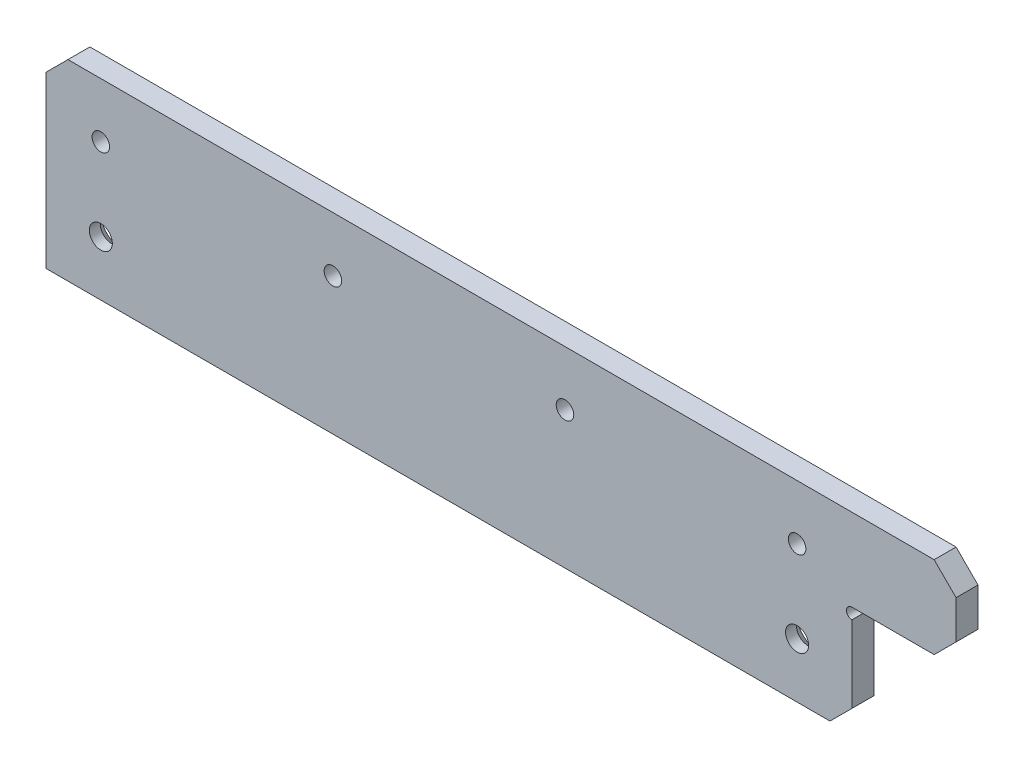
ISO-10303-21;
HEADER;
FILE_DESCRIPTION(('STEP AP214'),'2;1');
FILE_NAME('part.step','',(''),(''),'','','');
FILE_SCHEMA(('AUTOMOTIVE_DESIGN { 1 0 10303 214 1 1 1 1 }'));
ENDSEC;
DATA;
#1=APPLICATION_CONTEXT('core data for automotive mechanical design processes');
#2=APPLICATION_PROTOCOL_DEFINITION('international standard','automotive_design',2000,#1);
#3=PRODUCT_CONTEXT('',#1,'mechanical');
#4=PRODUCT('Part','Part','',(#3));
#5=PRODUCT_RELATED_PRODUCT_CATEGORY('part','',(#4));
#6=PRODUCT_DEFINITION_FORMATION('','',#4);
#7=PRODUCT_DEFINITION_CONTEXT('part definition',#1,'design');
#8=PRODUCT_DEFINITION('design','',#6,#7);
#9=PRODUCT_DEFINITION_SHAPE('','',#8);
#10=(LENGTH_UNIT() NAMED_UNIT(*) SI_UNIT(.MILLI.,.METRE.));
#11=(NAMED_UNIT(*) PLANE_ANGLE_UNIT() SI_UNIT($,.RADIAN.));
#12=(NAMED_UNIT(*) SI_UNIT($,.STERADIAN.) SOLID_ANGLE_UNIT());
#13=UNCERTAINTY_MEASURE_WITH_UNIT(LENGTH_MEASURE(1.E-05),#10,'distance_accuracy_value','');
#14=(GEOMETRIC_REPRESENTATION_CONTEXT(3) GLOBAL_UNCERTAINTY_ASSIGNED_CONTEXT((#13)) GLOBAL_UNIT_ASSIGNED_CONTEXT((#10,
#11,#12)) REPRESENTATION_CONTEXT('',''));
#15=CARTESIAN_POINT('',(0.,0.,0.));
#16=DIRECTION('',(0.,0.,1.));
#17=DIRECTION('',(1.,0.,0.));
#18=AXIS2_PLACEMENT_3D('',#15,#16,#17);
#19=CARTESIAN_POINT('',(-73.5,-17.5,2.));
#20=DIRECTION('',(1.,0.,0.));
#21=DIRECTION('',(0.,0.,-1.));
#22=AXIS2_PLACEMENT_3D('',#19,#20,#21);
#23=PLANE('',#22);
#24=DIRECTION('',(0.,-1.,0.));
#25=VECTOR('',#24,1.);
#26=CARTESIAN_POINT('',(-73.5,-17.5,2.));
#27=LINE('',#26,#25);
#28=CARTESIAN_POINT('',(-73.5,13.5,2.));
#29=VERTEX_POINT('',#28);
#30=CARTESIAN_POINT('',(-73.5,-17.5,2.));
#31=VERTEX_POINT('',#30);
#32=EDGE_CURVE('E161',#29,#31,#27,.T.);
#33=ORIENTED_EDGE('',*,*,#32,.F.);
#34=DIRECTION('',(0.,0.,-1.));
#35=VECTOR('',#34,1.);
#36=CARTESIAN_POINT('',(-73.5,13.5,2.));
#37=LINE('',#36,#35);
#38=CARTESIAN_POINT('',(-73.5,13.5,-2.));
#39=VERTEX_POINT('',#38);
#40=EDGE_CURVE('E211',#29,#39,#37,.T.);
#41=ORIENTED_EDGE('',*,*,#40,.T.);
#42=DIRECTION('',(0.,-1.,0.));
#43=VECTOR('',#42,1.);
#44=CARTESIAN_POINT('',(-73.5,-17.5,-2.));
#45=LINE('',#44,#43);
#46=CARTESIAN_POINT('',(-73.5,-17.5,-2.));
#47=VERTEX_POINT('',#46);
#48=EDGE_CURVE('E132',#39,#47,#45,.T.);
#49=ORIENTED_EDGE('',*,*,#48,.T.);
#50=DIRECTION('',(0.,0.,-1.));
#51=VECTOR('',#50,1.);
#52=CARTESIAN_POINT('',(-73.5,-17.5,2.));
#53=LINE('',#52,#51);
#54=EDGE_CURVE('E171',#31,#47,#53,.T.);
#55=ORIENTED_EDGE('',*,*,#54,.F.);
#56=EDGE_LOOP('',(#33,#41,#49,#55));
#57=FACE_BOUND('',#56,.T.);
#58=ADVANCED_FACE('F37',(#57),#23,.F.);
#59=CARTESIAN_POINT('',(73.5,-17.5,2.));
#60=DIRECTION('',(0.,1.,0.));
#61=DIRECTION('',(-1.,0.,0.));
#62=AXIS2_PLACEMENT_3D('',#59,#60,#61);
#63=PLANE('',#62);
#64=DIRECTION('',(1.,0.,0.));
#65=VECTOR('',#64,1.);
#66=CARTESIAN_POINT('',(73.5,-17.5,-2.));
#67=LINE('',#66,#65);
#68=CARTESIAN_POINT('',(69.5,-17.5,-2.));
#69=VERTEX_POINT('',#68);
#70=EDGE_CURVE('E173',#47,#69,#67,.T.);
#71=ORIENTED_EDGE('',*,*,#70,.T.);
#72=DIRECTION('',(0.,0.,1.));
#73=VECTOR('',#72,1.);
#74=CARTESIAN_POINT('',(69.5,-17.5,2.));
#75=LINE('',#74,#73);
#76=CARTESIAN_POINT('',(69.5,-17.5,2.));
#77=VERTEX_POINT('',#76);
#78=EDGE_CURVE('E209',#69,#77,#75,.T.);
#79=ORIENTED_EDGE('',*,*,#78,.T.);
#80=DIRECTION('',(1.,0.,0.));
#81=VECTOR('',#80,1.);
#82=CARTESIAN_POINT('',(73.5,-17.5,2.));
#83=LINE('',#82,#81);
#84=EDGE_CURVE('E163',#31,#77,#83,.T.);
#85=ORIENTED_EDGE('',*,*,#84,.F.);
#86=ORIENTED_EDGE('',*,*,#54,.T.);
#87=EDGE_LOOP('',(#71,#79,#85,#86));
#88=FACE_BOUND('',#87,.T.);
#89=ADVANCED_FACE('F304',(#88),#63,.F.);
#90=CARTESIAN_POINT('',(73.5,-17.5,2.));
#91=DIRECTION('',(-1.,0.,0.));
#92=DIRECTION('',(0.,0.,1.));
#93=AXIS2_PLACEMENT_3D('',#90,#91,#92);
#94=PLANE('',#93);
#95=DIRECTION('',(0.,1.,0.));
#96=VECTOR('',#95,1.);
#97=CARTESIAN_POINT('',(73.5,-17.5,-2.));
#98=LINE('',#97,#96);
#99=CARTESIAN_POINT('',(73.5,-13.5,-2.));
#100=VERTEX_POINT('',#99);
#101=CARTESIAN_POINT('',(73.5,0.500000000000011,-2.));
#102=VERTEX_POINT('',#101);
#103=EDGE_CURVE('E175',#100,#102,#98,.T.);
#104=ORIENTED_EDGE('',*,*,#103,.T.);
#105=DIRECTION('',(0.,0.,1.));
#106=VECTOR('',#105,1.);
#107=CARTESIAN_POINT('',(73.5,0.500000000000011,-2.));
#108=LINE('',#107,#106);
#109=CARTESIAN_POINT('',(73.5,0.500000000000011,2.));
#110=VERTEX_POINT('',#109);
#111=EDGE_CURVE('E257',#102,#110,#108,.T.);
#112=ORIENTED_EDGE('',*,*,#111,.T.);
#113=DIRECTION('',(0.,1.,0.));
#114=VECTOR('',#113,1.);
#115=CARTESIAN_POINT('',(73.5,-17.5,2.));
#116=LINE('',#115,#114);
#117=CARTESIAN_POINT('',(73.5,-13.5,2.));
#118=VERTEX_POINT('',#117);
#119=EDGE_CURVE('E142',#118,#110,#116,.T.);
#120=ORIENTED_EDGE('',*,*,#119,.F.);
#121=DIRECTION('',(0.,0.,-1.));
#122=VECTOR('',#121,1.);
#123=CARTESIAN_POINT('',(73.5,-13.5,2.));
#124=LINE('',#123,#122);
#125=EDGE_CURVE('E207',#118,#100,#124,.T.);
#126=ORIENTED_EDGE('',*,*,#125,.T.);
#127=EDGE_LOOP('',(#104,#112,#120,#126));
#128=FACE_BOUND('',#127,.T.);
#129=ADVANCED_FACE('F310',(#128),#94,.F.);
#130=CARTESIAN_POINT('',(73.5,17.5,2.));
#131=DIRECTION('',(0.,-1.,0.));
#132=DIRECTION('',(1.,0.,0.));
#133=AXIS2_PLACEMENT_3D('',#130,#131,#132);
#134=PLANE('',#133);
#135=DIRECTION('',(-1.,0.,0.));
#136=VECTOR('',#135,1.);
#137=CARTESIAN_POINT('',(73.5,17.5,2.));
#138=LINE('',#137,#136);
#139=CARTESIAN_POINT('',(88.5,17.5,2.));
#140=VERTEX_POINT('',#139);
#141=CARTESIAN_POINT('',(-69.5,17.5,2.));
#142=VERTEX_POINT('',#141);
#143=EDGE_CURVE('E168',#140,#142,#138,.T.);
#144=ORIENTED_EDGE('',*,*,#143,.F.);
#145=DIRECTION('',(0.,0.,-1.));
#146=VECTOR('',#145,1.);
#147=CARTESIAN_POINT('',(88.5,17.5,-2.));
#148=LINE('',#147,#146);
#149=CARTESIAN_POINT('',(88.5,17.5,-2.));
#150=VERTEX_POINT('',#149);
#151=EDGE_CURVE('E197',#140,#150,#148,.T.);
#152=ORIENTED_EDGE('',*,*,#151,.T.);
#153=DIRECTION('',(-1.,0.,0.));
#154=VECTOR('',#153,1.);
#155=CARTESIAN_POINT('',(73.5,17.5,-2.));
#156=LINE('',#155,#154);
#157=CARTESIAN_POINT('',(-69.5,17.5,-2.));
#158=VERTEX_POINT('',#157);
#159=EDGE_CURVE('E164',#150,#158,#156,.T.);
#160=ORIENTED_EDGE('',*,*,#159,.T.);
#161=DIRECTION('',(0.,0.,1.));
#162=VECTOR('',#161,1.);
#163=CARTESIAN_POINT('',(-69.5,17.5,2.));
#164=LINE('',#163,#162);
#165=EDGE_CURVE('E195',#158,#142,#164,.T.);
#166=ORIENTED_EDGE('',*,*,#165,.T.);
#167=EDGE_LOOP('',(#144,#152,#160,#166));
#168=FACE_BOUND('',#167,.T.);
#169=ADVANCED_FACE('F281',(#168),#134,.F.);
#170=CARTESIAN_POINT('',(0.,0.,2.));
#171=DIRECTION('',(0.,0.,1.));
#172=DIRECTION('',(1.,0.,0.));
#173=AXIS2_PLACEMENT_3D('',#170,#171,#172);
#174=PLANE('',#173);
#175=CARTESIAN_POINT('',(-63.5,7.49999999999999,2.));
#176=DIRECTION('',(0.,0.,1.));
#177=DIRECTION('',(1.,0.,0.));
#178=AXIS2_PLACEMENT_3D('',#175,#176,#177);
#179=CIRCLE('',#178,1.6);
#180=CARTESIAN_POINT('',(-61.9,7.49999999999999,2.));
#181=VERTEX_POINT('',#180);
#182=EDGE_CURVE('E273',#181,#181,#179,.T.);
#183=ORIENTED_EDGE('',*,*,#182,.F.);
#184=EDGE_LOOP('',(#183));
#185=FACE_BOUND('',#184,.T.);
#186=CARTESIAN_POINT('',(-21.1666666666667,7.49999999999999,2.));
#187=DIRECTION('',(0.,0.,1.));
#188=DIRECTION('',(1.,0.,0.));
#189=AXIS2_PLACEMENT_3D('',#186,#187,#188);
#190=CIRCLE('',#189,1.6);
#191=CARTESIAN_POINT('',(-19.5666666666667,7.49999999999999,2.));
#192=VERTEX_POINT('',#191);
#193=EDGE_CURVE('E269',#192,#192,#190,.T.);
#194=ORIENTED_EDGE('',*,*,#193,.F.);
#195=EDGE_LOOP('',(#194));
#196=FACE_BOUND('',#195,.T.);
#197=CARTESIAN_POINT('',(21.1666666666667,7.49999999999999,2.));
#198=DIRECTION('',(0.,0.,1.));
#199=DIRECTION('',(1.,0.,0.));
#200=AXIS2_PLACEMENT_3D('',#197,#198,#199);
#201=CIRCLE('',#200,1.6);
#202=CARTESIAN_POINT('',(22.7666666666667,7.49999999999999,2.));
#203=VERTEX_POINT('',#202);
#204=EDGE_CURVE('E265',#203,#203,#201,.T.);
#205=ORIENTED_EDGE('',*,*,#204,.F.);
#206=EDGE_LOOP('',(#205));
#207=FACE_BOUND('',#206,.T.);
#208=CARTESIAN_POINT('',(63.5,7.49999999999999,2.));
#209=DIRECTION('',(0.,0.,1.));
#210=DIRECTION('',(1.,0.,0.));
#211=AXIS2_PLACEMENT_3D('',#208,#209,#210);
#212=CIRCLE('',#211,1.6);
#213=CARTESIAN_POINT('',(65.1,7.49999999999999,2.));
#214=VERTEX_POINT('',#213);
#215=EDGE_CURVE('E261',#214,#214,#212,.T.);
#216=ORIENTED_EDGE('',*,*,#215,.F.);
#217=EDGE_LOOP('',(#216));
#218=FACE_BOUND('',#217,.T.);
#219=CARTESIAN_POINT('',(73.5,1.50000000000001,2.));
#220=DIRECTION('',(0.,0.,1.));
#221=DIRECTION('',(1.,0.,0.));
#222=AXIS2_PLACEMENT_3D('',#219,#220,#221);
#223=CIRCLE('',#222,0.999999999999998);
#224=CARTESIAN_POINT('',(73.5,2.50000000000001,2.));
#225=VERTEX_POINT('',#224);
#226=EDGE_CURVE('E124',#225,#110,#223,.T.);
#227=ORIENTED_EDGE('',*,*,#226,.F.);
#228=DIRECTION('',(1.,0.,0.));
#229=VECTOR('',#228,1.);
#230=CARTESIAN_POINT('',(73.5,2.50000000000001,2.));
#231=LINE('',#230,#229);
#232=CARTESIAN_POINT('',(88.5,2.50000000000001,2.));
#233=VERTEX_POINT('',#232);
#234=EDGE_CURVE('E140',#225,#233,#231,.T.);
#235=ORIENTED_EDGE('',*,*,#234,.T.);
#236=DIRECTION('',(-0.707106781186546,-0.707106781186549,0.));
#237=VECTOR('',#236,1.);
#238=CARTESIAN_POINT('',(43.0000000000001,-43.,2.));
#239=LINE('',#238,#237);
#240=CARTESIAN_POINT('',(92.5,6.50000000000004,2.));
#241=VERTEX_POINT('',#240);
#242=EDGE_CURVE('E191',#233,#241,#239,.F.);
#243=ORIENTED_EDGE('',*,*,#242,.T.);
#244=DIRECTION('',(0.,1.,0.));
#245=VECTOR('',#244,1.);
#246=CARTESIAN_POINT('',(92.5,17.5,2.));
#247=LINE('',#246,#245);
#248=CARTESIAN_POINT('',(92.5,13.5,2.));
#249=VERTEX_POINT('',#248);
#250=EDGE_CURVE('E149',#241,#249,#247,.T.);
#251=ORIENTED_EDGE('',*,*,#250,.T.);
#252=DIRECTION('',(-0.707106781186549,0.707106781186546,0.));
#253=VECTOR('',#252,1.);
#254=CARTESIAN_POINT('',(52.9999999999999,53.,2.));
#255=LINE('',#254,#253);
#256=EDGE_CURVE('E193',#249,#140,#255,.T.);
#257=ORIENTED_EDGE('',*,*,#256,.T.);
#258=ORIENTED_EDGE('',*,*,#143,.T.);
#259=DIRECTION('',(0.70710678118655,0.707106781186545,0.));
#260=VECTOR('',#259,1.);
#261=CARTESIAN_POINT('',(-43.4999999999997,43.5,2.));
#262=LINE('',#261,#260);
#263=EDGE_CURVE('E187',#142,#29,#262,.F.);
#264=ORIENTED_EDGE('',*,*,#263,.T.);
#265=ORIENTED_EDGE('',*,*,#32,.T.);
#266=ORIENTED_EDGE('',*,*,#84,.T.);
#267=DIRECTION('',(-0.707106781186549,-0.707106781186546,0.));
#268=VECTOR('',#267,1.);
#269=CARTESIAN_POINT('',(43.4999999999999,-43.5,2.));
#270=LINE('',#269,#268);
#271=EDGE_CURVE('E189',#77,#118,#270,.F.);
#272=ORIENTED_EDGE('',*,*,#271,.T.);
#273=ORIENTED_EDGE('',*,*,#119,.T.);
#274=EDGE_LOOP('',(#227,#235,#243,#251,#257,#258,#264,#265,#266,#272,#273));
#275=FACE_BOUND('',#274,.T.);
#276=CARTESIAN_POINT('',(-63.5,-7.50000000000001,2.));
#277=DIRECTION('',(0.,0.,1.));
#278=DIRECTION('',(1.,0.,0.));
#279=AXIS2_PLACEMENT_3D('',#276,#277,#278);
#280=CIRCLE('',#279,2.1);
#281=CARTESIAN_POINT('',(-61.4,-7.50000000000001,2.));
#282=VERTEX_POINT('',#281);
#283=EDGE_CURVE('E150',#282,#282,#280,.T.);
#284=ORIENTED_EDGE('',*,*,#283,.F.);
#285=EDGE_LOOP('',(#284));
#286=FACE_BOUND('',#285,.T.);
#287=CARTESIAN_POINT('',(63.5,-7.50000000000001,2.));
#288=DIRECTION('',(0.,0.,1.));
#289=DIRECTION('',(1.,0.,0.));
#290=AXIS2_PLACEMENT_3D('',#287,#288,#289);
#291=CIRCLE('',#290,2.09999999999999);
#292=CARTESIAN_POINT('',(65.6,-7.50000000000001,2.));
#293=VERTEX_POINT('',#292);
#294=EDGE_CURVE('E156',#293,#293,#291,.T.);
#295=ORIENTED_EDGE('',*,*,#294,.F.);
#296=EDGE_LOOP('',(#295));
#297=FACE_BOUND('',#296,.T.);
#298=ADVANCED_FACE('F138',(#185,#196,#207,#218,#275,#286,#297),#174,.T.);
#299=CARTESIAN_POINT('',(0.,0.,-2.));
#300=DIRECTION('',(0.,0.,1.));
#301=DIRECTION('',(1.,0.,0.));
#302=AXIS2_PLACEMENT_3D('',#299,#300,#301);
#303=PLANE('',#302);
#304=CARTESIAN_POINT('',(63.5,-7.50000000000001,-2.));
#305=DIRECTION('',(0.,0.,1.));
#306=DIRECTION('',(1.,0.,0.));
#307=AXIS2_PLACEMENT_3D('',#304,#305,#306);
#308=CIRCLE('',#307,4.10000000000001);
#309=CARTESIAN_POINT('',(67.6,-7.50000000000001,-2.));
#310=VERTEX_POINT('',#309);
#311=EDGE_CURVE('E217',#310,#310,#308,.T.);
#312=ORIENTED_EDGE('',*,*,#311,.T.);
#313=EDGE_LOOP('',(#312));
#314=FACE_BOUND('',#313,.T.);
#315=CARTESIAN_POINT('',(-63.5,-7.50000000000001,-2.));
#316=DIRECTION('',(0.,0.,1.));
#317=DIRECTION('',(1.,0.,0.));
#318=AXIS2_PLACEMENT_3D('',#315,#316,#317);
#319=CIRCLE('',#318,4.09999999999999);
#320=CARTESIAN_POINT('',(-59.4,-7.50000000000001,-2.));
#321=VERTEX_POINT('',#320);
#322=EDGE_CURVE('E214',#321,#321,#319,.T.);
#323=ORIENTED_EDGE('',*,*,#322,.T.);
#324=EDGE_LOOP('',(#323));
#325=FACE_BOUND('',#324,.T.);
#326=CARTESIAN_POINT('',(-63.5,7.49999999999999,-2.));
#327=DIRECTION('',(0.,0.,1.));
#328=DIRECTION('',(1.,0.,0.));
#329=AXIS2_PLACEMENT_3D('',#326,#327,#328);
#330=CIRCLE('',#329,1.6);
#331=CARTESIAN_POINT('',(-61.9,7.49999999999999,-2.));
#332=VERTEX_POINT('',#331);
#333=EDGE_CURVE('E143',#332,#332,#330,.T.);
#334=ORIENTED_EDGE('',*,*,#333,.T.);
#335=EDGE_LOOP('',(#334));
#336=FACE_BOUND('',#335,.T.);
#337=CARTESIAN_POINT('',(-21.1666666666667,7.49999999999999,-2.));
#338=DIRECTION('',(0.,0.,1.));
#339=DIRECTION('',(1.,0.,0.));
#340=AXIS2_PLACEMENT_3D('',#337,#338,#339);
#341=CIRCLE('',#340,1.6);
#342=CARTESIAN_POINT('',(-19.5666666666667,7.49999999999999,-2.));
#343=VERTEX_POINT('',#342);
#344=EDGE_CURVE('E244',#343,#343,#341,.T.);
#345=ORIENTED_EDGE('',*,*,#344,.T.);
#346=EDGE_LOOP('',(#345));
#347=FACE_BOUND('',#346,.T.);
#348=CARTESIAN_POINT('',(21.1666666666667,7.49999999999999,-2.));
#349=DIRECTION('',(0.,0.,1.));
#350=DIRECTION('',(1.,0.,0.));
#351=AXIS2_PLACEMENT_3D('',#348,#349,#350);
#352=CIRCLE('',#351,1.6);
#353=CARTESIAN_POINT('',(22.7666666666667,7.49999999999999,-2.));
#354=VERTEX_POINT('',#353);
#355=EDGE_CURVE('E248',#354,#354,#352,.T.);
#356=ORIENTED_EDGE('',*,*,#355,.T.);
#357=EDGE_LOOP('',(#356));
#358=FACE_BOUND('',#357,.T.);
#359=CARTESIAN_POINT('',(63.5,7.49999999999999,-2.));
#360=DIRECTION('',(0.,0.,1.));
#361=DIRECTION('',(1.,0.,0.));
#362=AXIS2_PLACEMENT_3D('',#359,#360,#361);
#363=CIRCLE('',#362,1.6);
#364=CARTESIAN_POINT('',(65.1,7.49999999999999,-2.));
#365=VERTEX_POINT('',#364);
#366=EDGE_CURVE('E251',#365,#365,#363,.T.);
#367=ORIENTED_EDGE('',*,*,#366,.T.);
#368=EDGE_LOOP('',(#367));
#369=FACE_BOUND('',#368,.T.);
#370=DIRECTION('',(1.,0.,0.));
#371=VECTOR('',#370,1.);
#372=CARTESIAN_POINT('',(73.5,2.50000000000001,-2.));
#373=LINE('',#372,#371);
#374=CARTESIAN_POINT('',(73.5,2.50000000000001,-2.));
#375=VERTEX_POINT('',#374);
#376=CARTESIAN_POINT('',(88.5,2.50000000000001,-2.));
#377=VERTEX_POINT('',#376);
#378=EDGE_CURVE('E153',#375,#377,#373,.T.);
#379=ORIENTED_EDGE('',*,*,#378,.F.);
#380=CARTESIAN_POINT('',(73.5,1.50000000000001,-2.));
#381=DIRECTION('',(0.,0.,1.));
#382=DIRECTION('',(1.,0.,0.));
#383=AXIS2_PLACEMENT_3D('',#380,#381,#382);
#384=CIRCLE('',#383,0.999999999999998);
#385=EDGE_CURVE('E127',#375,#102,#384,.T.);
#386=ORIENTED_EDGE('',*,*,#385,.T.);
#387=ORIENTED_EDGE('',*,*,#103,.F.);
#388=DIRECTION('',(0.707106781186549,0.707106781186546,0.));
#389=VECTOR('',#388,1.);
#390=CARTESIAN_POINT('',(73.5,-13.5,-2.));
#391=LINE('',#390,#389);
#392=EDGE_CURVE('E53',#100,#69,#391,.F.);
#393=ORIENTED_EDGE('',*,*,#392,.T.);
#394=ORIENTED_EDGE('',*,*,#70,.F.);
#395=ORIENTED_EDGE('',*,*,#48,.F.);
#396=DIRECTION('',(-0.70710678118655,-0.707106781186545,0.));
#397=VECTOR('',#396,1.);
#398=CARTESIAN_POINT('',(-73.5,13.5,-2.));
#399=LINE('',#398,#397);
#400=EDGE_CURVE('E199',#39,#158,#399,.F.);
#401=ORIENTED_EDGE('',*,*,#400,.T.);
#402=ORIENTED_EDGE('',*,*,#159,.F.);
#403=DIRECTION('',(0.707106781186549,-0.707106781186546,0.));
#404=VECTOR('',#403,1.);
#405=CARTESIAN_POINT('',(92.5,13.5,-2.));
#406=LINE('',#405,#404);
#407=CARTESIAN_POINT('',(92.5,13.5,-2.));
#408=VERTEX_POINT('',#407);
#409=EDGE_CURVE('E204',#150,#408,#406,.T.);
#410=ORIENTED_EDGE('',*,*,#409,.T.);
#411=DIRECTION('',(0.,1.,0.));
#412=VECTOR('',#411,1.);
#413=CARTESIAN_POINT('',(92.5,17.5,-2.));
#414=LINE('',#413,#412);
#415=CARTESIAN_POINT('',(92.5,6.50000000000004,-2.));
#416=VERTEX_POINT('',#415);
#417=EDGE_CURVE('E133',#416,#408,#414,.T.);
#418=ORIENTED_EDGE('',*,*,#417,.F.);
#419=DIRECTION('',(0.707106781186546,0.707106781186549,0.));
#420=VECTOR('',#419,1.);
#421=CARTESIAN_POINT('',(88.5,2.50000000000001,-2.));
#422=LINE('',#421,#420);
#423=EDGE_CURVE('E202',#416,#377,#422,.F.);
#424=ORIENTED_EDGE('',*,*,#423,.T.);
#425=EDGE_LOOP('',(#379,#386,#387,#393,#394,#395,#401,#402,#410,#418,#424));
#426=FACE_BOUND('',#425,.T.);
#427=ADVANCED_FACE('F231',(#314,#325,#336,#347,#358,#369,#426),#303,.F.);
#428=CARTESIAN_POINT('',(92.5,17.5,-2.));
#429=DIRECTION('',(1.,0.,0.));
#430=DIRECTION('',(0.,0.,-1.));
#431=AXIS2_PLACEMENT_3D('',#428,#429,#430);
#432=PLANE('',#431);
#433=ORIENTED_EDGE('',*,*,#417,.T.);
#434=DIRECTION('',(0.,0.,1.));
#435=VECTOR('',#434,1.);
#436=CARTESIAN_POINT('',(92.5,13.5,2.));
#437=LINE('',#436,#435);
#438=EDGE_CURVE('E184',#408,#249,#437,.T.);
#439=ORIENTED_EDGE('',*,*,#438,.T.);
#440=ORIENTED_EDGE('',*,*,#250,.F.);
#441=DIRECTION('',(0.,0.,-1.));
#442=VECTOR('',#441,1.);
#443=CARTESIAN_POINT('',(92.5,6.50000000000004,-2.));
#444=LINE('',#443,#442);
#445=EDGE_CURVE('E182',#241,#416,#444,.T.);
#446=ORIENTED_EDGE('',*,*,#445,.T.);
#447=EDGE_LOOP('',(#433,#439,#440,#446));
#448=FACE_BOUND('',#447,.T.);
#449=ADVANCED_FACE('F234',(#448),#432,.T.);
#450=CARTESIAN_POINT('',(73.5,2.50000000000001,-2.));
#451=DIRECTION('',(0.,-1.,0.));
#452=DIRECTION('',(0.,0.,-1.));
#453=AXIS2_PLACEMENT_3D('',#450,#451,#452);
#454=PLANE('',#453);
#455=ORIENTED_EDGE('',*,*,#378,.T.);
#456=DIRECTION('',(0.,0.,1.));
#457=VECTOR('',#456,1.);
#458=CARTESIAN_POINT('',(88.5,2.50000000000001,-2.));
#459=LINE('',#458,#457);
#460=EDGE_CURVE('E148',#377,#233,#459,.T.);
#461=ORIENTED_EDGE('',*,*,#460,.T.);
#462=ORIENTED_EDGE('',*,*,#234,.F.);
#463=DIRECTION('',(0.,0.,1.));
#464=VECTOR('',#463,1.);
#465=CARTESIAN_POINT('',(73.5,2.50000000000001,-2.));
#466=LINE('',#465,#464);
#467=EDGE_CURVE('E121',#375,#225,#466,.T.);
#468=ORIENTED_EDGE('',*,*,#467,.F.);
#469=EDGE_LOOP('',(#455,#461,#462,#468));
#470=FACE_BOUND('',#469,.T.);
#471=ADVANCED_FACE('F146',(#470),#454,.T.);
#472=CARTESIAN_POINT('',(63.5,-7.50000000000001,-2.));
#473=DIRECTION('',(0.,0.,1.));
#474=DIRECTION('',(1.,0.,0.));
#475=AXIS2_PLACEMENT_3D('',#472,#473,#474);
#476=CYLINDRICAL_SURFACE('',#475,2.09999999999999);
#477=CARTESIAN_POINT('',(63.5,-7.50000000000001,0.));
#478=DIRECTION('',(0.,0.,1.));
#479=DIRECTION('',(1.,0.,0.));
#480=AXIS2_PLACEMENT_3D('',#477,#478,#479);
#481=CIRCLE('',#480,2.09999999999999);
#482=CARTESIAN_POINT('',(65.6,-7.50000000000001,0.));
#483=VERTEX_POINT('',#482);
#484=EDGE_CURVE('E46',#483,#483,#481,.F.);
#485=ORIENTED_EDGE('',*,*,#484,.T.);
#486=EDGE_LOOP('',(#485));
#487=FACE_BOUND('',#486,.T.);
#488=ORIENTED_EDGE('',*,*,#294,.T.);
#489=EDGE_LOOP('',(#488));
#490=FACE_BOUND('',#489,.T.);
#491=ADVANCED_FACE('F222',(#487,#490),#476,.F.);
#492=CARTESIAN_POINT('',(-63.5,-7.50000000000001,-2.));
#493=DIRECTION('',(0.,0.,1.));
#494=DIRECTION('',(1.,0.,0.));
#495=AXIS2_PLACEMENT_3D('',#492,#493,#494);
#496=CYLINDRICAL_SURFACE('',#495,2.1);
#497=CARTESIAN_POINT('',(-63.5,-7.50000000000001,0.));
#498=DIRECTION('',(0.,0.,1.));
#499=DIRECTION('',(1.,0.,0.));
#500=AXIS2_PLACEMENT_3D('',#497,#498,#499);
#501=CIRCLE('',#500,2.1);
#502=CARTESIAN_POINT('',(-61.4,-7.50000000000001,0.));
#503=VERTEX_POINT('',#502);
#504=EDGE_CURVE('E11',#503,#503,#501,.F.);
#505=ORIENTED_EDGE('',*,*,#504,.T.);
#506=EDGE_LOOP('',(#505));
#507=FACE_BOUND('',#506,.T.);
#508=ORIENTED_EDGE('',*,*,#283,.T.);
#509=EDGE_LOOP('',(#508));
#510=FACE_BOUND('',#509,.T.);
#511=ADVANCED_FACE('F324',(#507,#510),#496,.F.);
#512=CARTESIAN_POINT('',(92.5,13.5,-2.));
#513=DIRECTION('',(0.707106781186546,0.707106781186549,0.));
#514=DIRECTION('',(0.,0.,-1.));
#515=AXIS2_PLACEMENT_3D('',#512,#513,#514);
#516=PLANE('',#515);
#517=ORIENTED_EDGE('',*,*,#409,.F.);
#518=ORIENTED_EDGE('',*,*,#151,.F.);
#519=ORIENTED_EDGE('',*,*,#256,.F.);
#520=ORIENTED_EDGE('',*,*,#438,.F.);
#521=EDGE_LOOP('',(#517,#518,#519,#520));
#522=FACE_BOUND('',#521,.T.);
#523=ADVANCED_FACE('F317',(#522),#516,.T.);
#524=CARTESIAN_POINT('',(88.5,2.50000000000001,-2.));
#525=DIRECTION('',(-0.707106781186549,0.707106781186546,0.));
#526=DIRECTION('',(0.,0.,1.));
#527=AXIS2_PLACEMENT_3D('',#524,#525,#526);
#528=PLANE('',#527);
#529=ORIENTED_EDGE('',*,*,#423,.F.);
#530=ORIENTED_EDGE('',*,*,#445,.F.);
#531=ORIENTED_EDGE('',*,*,#242,.F.);
#532=ORIENTED_EDGE('',*,*,#460,.F.);
#533=EDGE_LOOP('',(#529,#530,#531,#532));
#534=FACE_BOUND('',#533,.T.);
#535=ADVANCED_FACE('F323',(#534),#528,.F.);
#536=CARTESIAN_POINT('',(73.5,-13.5,2.));
#537=DIRECTION('',(-0.707106781186546,0.707106781186549,0.));
#538=DIRECTION('',(0.,0.,-1.));
#539=AXIS2_PLACEMENT_3D('',#536,#537,#538);
#540=PLANE('',#539);
#541=ORIENTED_EDGE('',*,*,#271,.F.);
#542=ORIENTED_EDGE('',*,*,#78,.F.);
#543=ORIENTED_EDGE('',*,*,#392,.F.);
#544=ORIENTED_EDGE('',*,*,#125,.F.);
#545=EDGE_LOOP('',(#541,#542,#543,#544));
#546=FACE_BOUND('',#545,.T.);
#547=ADVANCED_FACE('F331',(#546),#540,.F.);
#548=CARTESIAN_POINT('',(-73.5,13.5,2.));
#549=DIRECTION('',(0.707106781186545,-0.70710678118655,0.));
#550=DIRECTION('',(0.,0.,-1.));
#551=AXIS2_PLACEMENT_3D('',#548,#549,#550);
#552=PLANE('',#551);
#553=ORIENTED_EDGE('',*,*,#263,.F.);
#554=ORIENTED_EDGE('',*,*,#165,.F.);
#555=ORIENTED_EDGE('',*,*,#400,.F.);
#556=ORIENTED_EDGE('',*,*,#40,.F.);
#557=EDGE_LOOP('',(#553,#554,#555,#556));
#558=FACE_BOUND('',#557,.T.);
#559=ADVANCED_FACE('F301',(#558),#552,.F.);
#560=CARTESIAN_POINT('',(73.5,1.50000000000001,-2.));
#561=DIRECTION('',(0.,0.,1.));
#562=DIRECTION('',(1.,0.,0.));
#563=AXIS2_PLACEMENT_3D('',#560,#561,#562);
#564=CYLINDRICAL_SURFACE('',#563,0.999999999999998);
#565=ORIENTED_EDGE('',*,*,#385,.F.);
#566=ORIENTED_EDGE('',*,*,#467,.T.);
#567=ORIENTED_EDGE('',*,*,#226,.T.);
#568=ORIENTED_EDGE('',*,*,#111,.F.);
#569=EDGE_LOOP('',(#565,#566,#567,#568));
#570=FACE_BOUND('',#569,.T.);
#571=ADVANCED_FACE('F123',(#570),#564,.F.);
#572=CARTESIAN_POINT('',(63.5,7.49999999999999,-2.));
#573=DIRECTION('',(0.,0.,1.));
#574=DIRECTION('',(1.,0.,0.));
#575=AXIS2_PLACEMENT_3D('',#572,#573,#574);
#576=CYLINDRICAL_SURFACE('',#575,1.6);
#577=ORIENTED_EDGE('',*,*,#366,.F.);
#578=EDGE_LOOP('',(#577));
#579=FACE_BOUND('',#578,.T.);
#580=ORIENTED_EDGE('',*,*,#215,.T.);
#581=EDGE_LOOP('',(#580));
#582=FACE_BOUND('',#581,.T.);
#583=ADVANCED_FACE('F289',(#579,#582),#576,.F.);
#584=CARTESIAN_POINT('',(21.1666666666667,7.49999999999999,-2.));
#585=DIRECTION('',(0.,0.,1.));
#586=DIRECTION('',(1.,0.,0.));
#587=AXIS2_PLACEMENT_3D('',#584,#585,#586);
#588=CYLINDRICAL_SURFACE('',#587,1.6);
#589=ORIENTED_EDGE('',*,*,#355,.F.);
#590=EDGE_LOOP('',(#589));
#591=FACE_BOUND('',#590,.T.);
#592=ORIENTED_EDGE('',*,*,#204,.T.);
#593=EDGE_LOOP('',(#592));
#594=FACE_BOUND('',#593,.T.);
#595=ADVANCED_FACE('F291',(#591,#594),#588,.F.);
#596=CARTESIAN_POINT('',(-21.1666666666667,7.49999999999999,-2.));
#597=DIRECTION('',(0.,0.,1.));
#598=DIRECTION('',(1.,0.,0.));
#599=AXIS2_PLACEMENT_3D('',#596,#597,#598);
#600=CYLINDRICAL_SURFACE('',#599,1.6);
#601=ORIENTED_EDGE('',*,*,#344,.F.);
#602=EDGE_LOOP('',(#601));
#603=FACE_BOUND('',#602,.T.);
#604=ORIENTED_EDGE('',*,*,#193,.T.);
#605=EDGE_LOOP('',(#604));
#606=FACE_BOUND('',#605,.T.);
#607=ADVANCED_FACE('F298',(#603,#606),#600,.F.);
#608=CARTESIAN_POINT('',(-63.5,7.49999999999999,-2.));
#609=DIRECTION('',(0.,0.,1.));
#610=DIRECTION('',(1.,0.,0.));
#611=AXIS2_PLACEMENT_3D('',#608,#609,#610);
#612=CYLINDRICAL_SURFACE('',#611,1.6);
#613=ORIENTED_EDGE('',*,*,#333,.F.);
#614=EDGE_LOOP('',(#613));
#615=FACE_BOUND('',#614,.T.);
#616=ORIENTED_EDGE('',*,*,#182,.T.);
#617=EDGE_LOOP('',(#616));
#618=FACE_BOUND('',#617,.T.);
#619=ADVANCED_FACE('F228',(#615,#618),#612,.F.);
#620=CARTESIAN_POINT('',(63.5,-7.50000000000001,-2.));
#621=DIRECTION('',(0.,0.,-1.));
#622=DIRECTION('',(-1.,0.,0.));
#623=AXIS2_PLACEMENT_3D('',#620,#621,#622);
#624=CONICAL_SURFACE('',#623,4.10000000000001,0.785398163397447);
#625=ORIENTED_EDGE('',*,*,#484,.F.);
#626=EDGE_LOOP('',(#625));
#627=FACE_BOUND('',#626,.T.);
#628=ORIENTED_EDGE('',*,*,#311,.F.);
#629=EDGE_LOOP('',(#628));
#630=FACE_BOUND('',#629,.T.);
#631=ADVANCED_FACE('F225',(#627,#630),#624,.F.);
#632=CARTESIAN_POINT('',(-63.5,-7.50000000000001,-2.));
#633=DIRECTION('',(0.,0.,-1.));
#634=DIRECTION('',(-1.,0.,0.));
#635=AXIS2_PLACEMENT_3D('',#632,#633,#634);
#636=CONICAL_SURFACE('',#635,4.09999999999999,0.785398163397443);
#637=ORIENTED_EDGE('',*,*,#504,.F.);
#638=EDGE_LOOP('',(#637));
#639=FACE_BOUND('',#638,.T.);
#640=ORIENTED_EDGE('',*,*,#322,.F.);
#641=EDGE_LOOP('',(#640));
#642=FACE_BOUND('',#641,.T.);
#643=ADVANCED_FACE('F40',(#639,#642),#636,.F.);
#644=CLOSED_SHELL('',(#58,#89,#129,#169,#298,#427,#449,#471,#491,#511,#523,#535,#547,#559,#571,
#583,#595,#607,#619,#631,#643));
#645=MANIFOLD_SOLID_BREP('B2',#644);
#646=ADVANCED_BREP_SHAPE_REPRESENTATION('',(#18,#645),#14);
#647=SHAPE_DEFINITION_REPRESENTATION(#9,#646);
ENDSEC;
END-ISO-10303-21;
